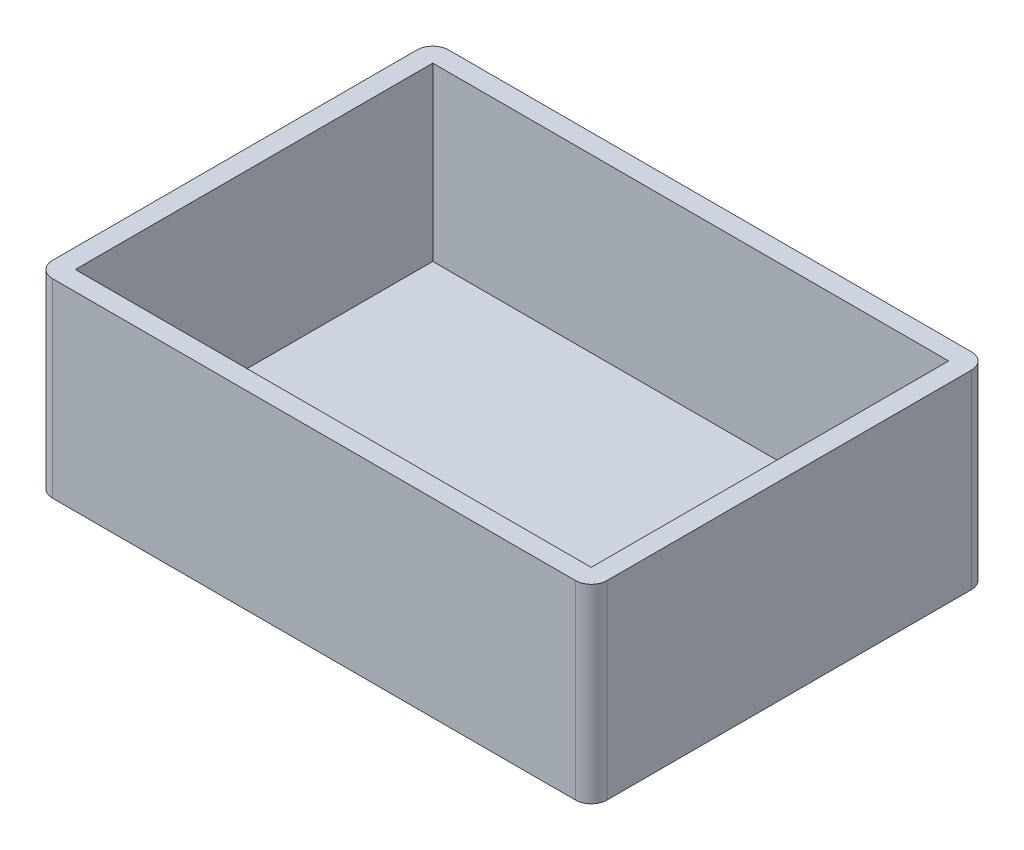
ISO-10303-21;
HEADER;
FILE_DESCRIPTION(('STEP AP214'),'2;1');
FILE_NAME('part.step','',(''),(''),'','','');
FILE_SCHEMA(('AUTOMOTIVE_DESIGN { 1 0 10303 214 1 1 1 1 }'));
ENDSEC;
DATA;
#1=APPLICATION_CONTEXT('core data for automotive mechanical design processes');
#2=APPLICATION_PROTOCOL_DEFINITION('international standard','automotive_design',2000,#1);
#3=PRODUCT_CONTEXT('',#1,'mechanical');
#4=PRODUCT('Part','Part','',(#3));
#5=PRODUCT_RELATED_PRODUCT_CATEGORY('part','',(#4));
#6=PRODUCT_DEFINITION_FORMATION('','',#4);
#7=PRODUCT_DEFINITION_CONTEXT('part definition',#1,'design');
#8=PRODUCT_DEFINITION('design','',#6,#7);
#9=PRODUCT_DEFINITION_SHAPE('','',#8);
#10=(LENGTH_UNIT() NAMED_UNIT(*) SI_UNIT(.MILLI.,.METRE.));
#11=(NAMED_UNIT(*) PLANE_ANGLE_UNIT() SI_UNIT($,.RADIAN.));
#12=(NAMED_UNIT(*) SI_UNIT($,.STERADIAN.) SOLID_ANGLE_UNIT());
#13=UNCERTAINTY_MEASURE_WITH_UNIT(LENGTH_MEASURE(1.E-05),#10,'distance_accuracy_value','');
#14=(GEOMETRIC_REPRESENTATION_CONTEXT(3) GLOBAL_UNCERTAINTY_ASSIGNED_CONTEXT((#13)) GLOBAL_UNIT_ASSIGNED_CONTEXT((#10,
#11,#12)) REPRESENTATION_CONTEXT('',''));
#15=CARTESIAN_POINT('',(0.,0.,0.));
#16=DIRECTION('',(0.,0.,1.));
#17=DIRECTION('',(1.,0.,0.));
#18=AXIS2_PLACEMENT_3D('',#15,#16,#17);
#19=CARTESIAN_POINT('',(0.,120.,0.));
#20=DIRECTION('',(0.,1.,0.));
#21=DIRECTION('',(0.,0.,1.));
#22=AXIS2_PLACEMENT_3D('',#19,#20,#21);
#23=PLANE('',#22);
#24=DIRECTION('',(1.,0.,0.));
#25=VECTOR('',#24,1.);
#26=CARTESIAN_POINT('',(175.,120.,125.));
#27=LINE('',#26,#25);
#28=CARTESIAN_POINT('',(-165.,120.,125.));
#29=VERTEX_POINT('',#28);
#30=CARTESIAN_POINT('',(165.,120.,125.));
#31=VERTEX_POINT('',#30);
#32=EDGE_CURVE('E216',#29,#31,#27,.T.);
#33=ORIENTED_EDGE('',*,*,#32,.T.);
#34=CARTESIAN_POINT('',(165.,120.,115.));
#35=DIRECTION('',(0.,1.,0.));
#36=DIRECTION('',(0.,0.,1.));
#37=AXIS2_PLACEMENT_3D('',#34,#35,#36);
#38=CIRCLE('',#37,10.);
#39=CARTESIAN_POINT('',(175.,120.,115.));
#40=VERTEX_POINT('',#39);
#41=EDGE_CURVE('E256',#31,#40,#38,.T.);
#42=ORIENTED_EDGE('',*,*,#41,.T.);
#43=DIRECTION('',(0.,0.,-1.));
#44=VECTOR('',#43,1.);
#45=CARTESIAN_POINT('',(175.,120.,125.));
#46=LINE('',#45,#44);
#47=CARTESIAN_POINT('',(175.,120.,-115.));
#48=VERTEX_POINT('',#47);
#49=EDGE_CURVE('E220',#40,#48,#46,.T.);
#50=ORIENTED_EDGE('',*,*,#49,.T.);
#51=CARTESIAN_POINT('',(165.,120.,-115.));
#52=DIRECTION('',(0.,1.,0.));
#53=DIRECTION('',(0.,0.,1.));
#54=AXIS2_PLACEMENT_3D('',#51,#52,#53);
#55=CIRCLE('',#54,10.);
#56=CARTESIAN_POINT('',(165.,120.,-125.));
#57=VERTEX_POINT('',#56);
#58=EDGE_CURVE('E69',#48,#57,#55,.T.);
#59=ORIENTED_EDGE('',*,*,#58,.T.);
#60=DIRECTION('',(-1.,0.,0.));
#61=VECTOR('',#60,1.);
#62=CARTESIAN_POINT('',(175.,120.,-125.));
#63=LINE('',#62,#61);
#64=CARTESIAN_POINT('',(-165.,120.,-125.));
#65=VERTEX_POINT('',#64);
#66=EDGE_CURVE('E222',#57,#65,#63,.T.);
#67=ORIENTED_EDGE('',*,*,#66,.T.);
#68=CARTESIAN_POINT('',(-165.,120.,-115.));
#69=DIRECTION('',(0.,1.,0.));
#70=DIRECTION('',(0.,0.,1.));
#71=AXIS2_PLACEMENT_3D('',#68,#69,#70);
#72=CIRCLE('',#71,10.);
#73=CARTESIAN_POINT('',(-175.,120.,-115.));
#74=VERTEX_POINT('',#73);
#75=EDGE_CURVE('E252',#65,#74,#72,.T.);
#76=ORIENTED_EDGE('',*,*,#75,.T.);
#77=DIRECTION('',(0.,0.,1.));
#78=VECTOR('',#77,1.);
#79=CARTESIAN_POINT('',(-175.,120.,125.));
#80=LINE('',#79,#78);
#81=CARTESIAN_POINT('',(-175.,120.,115.));
#82=VERTEX_POINT('',#81);
#83=EDGE_CURVE('E213',#74,#82,#80,.T.);
#84=ORIENTED_EDGE('',*,*,#83,.T.);
#85=CARTESIAN_POINT('',(-165.,120.,115.));
#86=DIRECTION('',(0.,1.,0.));
#87=DIRECTION('',(0.,0.,1.));
#88=AXIS2_PLACEMENT_3D('',#85,#86,#87);
#89=CIRCLE('',#88,10.);
#90=EDGE_CURVE('E254',#82,#29,#89,.T.);
#91=ORIENTED_EDGE('',*,*,#90,.T.);
#92=EDGE_LOOP('',(#33,#42,#50,#59,#67,#76,#84,#91));
#93=FACE_BOUND('',#92,.T.);
#94=DIRECTION('',(1.,0.,0.));
#95=VECTOR('',#94,1.);
#96=CARTESIAN_POINT('',(162.8,120.,112.805));
#97=LINE('',#96,#95);
#98=CARTESIAN_POINT('',(-162.8,120.,112.805));
#99=VERTEX_POINT('',#98);
#100=CARTESIAN_POINT('',(162.8,120.,112.805));
#101=VERTEX_POINT('',#100);
#102=EDGE_CURVE('E194',#99,#101,#97,.T.);
#103=ORIENTED_EDGE('',*,*,#102,.F.);
#104=DIRECTION('',(0.,0.,1.));
#105=VECTOR('',#104,1.);
#106=CARTESIAN_POINT('',(-162.8,120.,112.805));
#107=LINE('',#106,#105);
#108=CARTESIAN_POINT('',(-162.8,120.,-112.805));
#109=VERTEX_POINT('',#108);
#110=EDGE_CURVE('E192',#109,#99,#107,.T.);
#111=ORIENTED_EDGE('',*,*,#110,.F.);
#112=DIRECTION('',(-1.,0.,0.));
#113=VECTOR('',#112,1.);
#114=CARTESIAN_POINT('',(162.8,120.,-112.805));
#115=LINE('',#114,#113);
#116=CARTESIAN_POINT('',(162.8,120.,-112.805));
#117=VERTEX_POINT('',#116);
#118=EDGE_CURVE('E199',#117,#109,#115,.T.);
#119=ORIENTED_EDGE('',*,*,#118,.F.);
#120=DIRECTION('',(0.,0.,-1.));
#121=VECTOR('',#120,1.);
#122=CARTESIAN_POINT('',(162.8,120.,112.805));
#123=LINE('',#122,#121);
#124=EDGE_CURVE('E196',#101,#117,#123,.T.);
#125=ORIENTED_EDGE('',*,*,#124,.F.);
#126=EDGE_LOOP('',(#103,#111,#119,#125));
#127=FACE_BOUND('',#126,.T.);
#128=ADVANCED_FACE('F49',(#93,#127),#23,.T.);
#129=CARTESIAN_POINT('',(0.,0.,0.));
#130=DIRECTION('',(0.,1.,0.));
#131=DIRECTION('',(0.,0.,1.));
#132=AXIS2_PLACEMENT_3D('',#129,#130,#131);
#133=PLANE('',#132);
#134=CARTESIAN_POINT('',(-155.,0.,105.));
#135=DIRECTION('',(0.,-1.,0.));
#136=DIRECTION('',(0.,0.,-1.));
#137=AXIS2_PLACEMENT_3D('',#134,#135,#136);
#138=CIRCLE('',#137,4.20000000000001);
#139=CARTESIAN_POINT('',(-155.,0.,100.8));
#140=VERTEX_POINT('',#139);
#141=EDGE_CURVE('E159',#140,#140,#138,.T.);
#142=ORIENTED_EDGE('',*,*,#141,.F.);
#143=EDGE_LOOP('',(#142));
#144=FACE_BOUND('',#143,.T.);
#145=CARTESIAN_POINT('',(155.,0.,105.));
#146=DIRECTION('',(0.,-1.,0.));
#147=DIRECTION('',(0.,0.,-1.));
#148=AXIS2_PLACEMENT_3D('',#145,#146,#147);
#149=CIRCLE('',#148,4.20000000000001);
#150=CARTESIAN_POINT('',(155.,0.,100.8));
#151=VERTEX_POINT('',#150);
#152=EDGE_CURVE('E158',#151,#151,#149,.T.);
#153=ORIENTED_EDGE('',*,*,#152,.F.);
#154=EDGE_LOOP('',(#153));
#155=FACE_BOUND('',#154,.T.);
#156=CARTESIAN_POINT('',(155.,0.,-105.));
#157=DIRECTION('',(0.,-1.,0.));
#158=DIRECTION('',(0.,0.,-1.));
#159=AXIS2_PLACEMENT_3D('',#156,#157,#158);
#160=CIRCLE('',#159,4.20000000000001);
#161=CARTESIAN_POINT('',(155.,0.,-109.2));
#162=VERTEX_POINT('',#161);
#163=EDGE_CURVE('E169',#162,#162,#160,.T.);
#164=ORIENTED_EDGE('',*,*,#163,.F.);
#165=EDGE_LOOP('',(#164));
#166=FACE_BOUND('',#165,.T.);
#167=CARTESIAN_POINT('',(-155.,0.,-105.));
#168=DIRECTION('',(0.,-1.,0.));
#169=DIRECTION('',(0.,0.,-1.));
#170=AXIS2_PLACEMENT_3D('',#167,#168,#169);
#171=CIRCLE('',#170,4.20000000000001);
#172=CARTESIAN_POINT('',(-155.,0.,-109.2));
#173=VERTEX_POINT('',#172);
#174=EDGE_CURVE('E175',#173,#173,#171,.T.);
#175=ORIENTED_EDGE('',*,*,#174,.F.);
#176=EDGE_LOOP('',(#175));
#177=FACE_BOUND('',#176,.T.);
#178=DIRECTION('',(0.,0.,-1.));
#179=VECTOR('',#178,1.);
#180=CARTESIAN_POINT('',(175.,0.,125.));
#181=LINE('',#180,#179);
#182=CARTESIAN_POINT('',(175.,0.,115.));
#183=VERTEX_POINT('',#182);
#184=CARTESIAN_POINT('',(175.,0.,-115.));
#185=VERTEX_POINT('',#184);
#186=EDGE_CURVE('E230',#183,#185,#181,.T.);
#187=ORIENTED_EDGE('',*,*,#186,.F.);
#188=CARTESIAN_POINT('',(165.,0.,115.));
#189=DIRECTION('',(0.,1.,0.));
#190=DIRECTION('',(0.,0.,1.));
#191=AXIS2_PLACEMENT_3D('',#188,#189,#190);
#192=CIRCLE('',#191,10.);
#193=CARTESIAN_POINT('',(165.,0.,125.));
#194=VERTEX_POINT('',#193);
#195=EDGE_CURVE('E244',#183,#194,#192,.F.);
#196=ORIENTED_EDGE('',*,*,#195,.T.);
#197=DIRECTION('',(1.,0.,0.));
#198=VECTOR('',#197,1.);
#199=CARTESIAN_POINT('',(175.,0.,125.));
#200=LINE('',#199,#198);
#201=CARTESIAN_POINT('',(-165.,0.,125.));
#202=VERTEX_POINT('',#201);
#203=EDGE_CURVE('E227',#202,#194,#200,.T.);
#204=ORIENTED_EDGE('',*,*,#203,.F.);
#205=CARTESIAN_POINT('',(-165.,0.,115.));
#206=DIRECTION('',(0.,1.,0.));
#207=DIRECTION('',(0.,0.,1.));
#208=AXIS2_PLACEMENT_3D('',#205,#206,#207);
#209=CIRCLE('',#208,10.);
#210=CARTESIAN_POINT('',(-175.,0.,115.));
#211=VERTEX_POINT('',#210);
#212=EDGE_CURVE('E242',#202,#211,#209,.F.);
#213=ORIENTED_EDGE('',*,*,#212,.T.);
#214=DIRECTION('',(0.,0.,1.));
#215=VECTOR('',#214,1.);
#216=CARTESIAN_POINT('',(-175.,0.,125.));
#217=LINE('',#216,#215);
#218=CARTESIAN_POINT('',(-175.,0.,-115.));
#219=VERTEX_POINT('',#218);
#220=EDGE_CURVE('E212',#219,#211,#217,.T.);
#221=ORIENTED_EDGE('',*,*,#220,.F.);
#222=CARTESIAN_POINT('',(-165.,0.,-115.));
#223=DIRECTION('',(0.,1.,0.));
#224=DIRECTION('',(0.,0.,1.));
#225=AXIS2_PLACEMENT_3D('',#222,#223,#224);
#226=CIRCLE('',#225,10.);
#227=CARTESIAN_POINT('',(-165.,0.,-125.));
#228=VERTEX_POINT('',#227);
#229=EDGE_CURVE('E240',#219,#228,#226,.F.);
#230=ORIENTED_EDGE('',*,*,#229,.T.);
#231=DIRECTION('',(-1.,0.,0.));
#232=VECTOR('',#231,1.);
#233=CARTESIAN_POINT('',(175.,0.,-125.));
#234=LINE('',#233,#232);
#235=CARTESIAN_POINT('',(165.,0.,-125.));
#236=VERTEX_POINT('',#235);
#237=EDGE_CURVE('E217',#236,#228,#234,.T.);
#238=ORIENTED_EDGE('',*,*,#237,.F.);
#239=CARTESIAN_POINT('',(165.,0.,-115.));
#240=DIRECTION('',(0.,1.,0.));
#241=DIRECTION('',(0.,0.,1.));
#242=AXIS2_PLACEMENT_3D('',#239,#240,#241);
#243=CIRCLE('',#242,10.);
#244=EDGE_CURVE('E238',#236,#185,#243,.F.);
#245=ORIENTED_EDGE('',*,*,#244,.T.);
#246=EDGE_LOOP('',(#187,#196,#204,#213,#221,#230,#238,#245));
#247=FACE_BOUND('',#246,.T.);
#248=ADVANCED_FACE('F269',(#144,#155,#166,#177,#247),#133,.F.);
#249=CARTESIAN_POINT('',(-175.,120.,125.));
#250=DIRECTION('',(1.,0.,0.));
#251=DIRECTION('',(0.,0.,-1.));
#252=AXIS2_PLACEMENT_3D('',#249,#250,#251);
#253=PLANE('',#252);
#254=ORIENTED_EDGE('',*,*,#220,.T.);
#255=DIRECTION('',(0.,-1.,0.));
#256=VECTOR('',#255,1.);
#257=CARTESIAN_POINT('',(-175.,120.,115.));
#258=LINE('',#257,#256);
#259=EDGE_CURVE('E261',#211,#82,#258,.F.);
#260=ORIENTED_EDGE('',*,*,#259,.T.);
#261=ORIENTED_EDGE('',*,*,#83,.F.);
#262=DIRECTION('',(0.,-1.,0.));
#263=VECTOR('',#262,1.);
#264=CARTESIAN_POINT('',(-175.,120.,-115.));
#265=LINE('',#264,#263);
#266=EDGE_CURVE('E258',#74,#219,#265,.T.);
#267=ORIENTED_EDGE('',*,*,#266,.T.);
#268=EDGE_LOOP('',(#254,#260,#261,#267));
#269=FACE_BOUND('',#268,.T.);
#270=ADVANCED_FACE('F277',(#269),#253,.F.);
#271=CARTESIAN_POINT('',(175.,120.,125.));
#272=DIRECTION('',(0.,0.,-1.));
#273=DIRECTION('',(-1.,0.,0.));
#274=AXIS2_PLACEMENT_3D('',#271,#272,#273);
#275=PLANE('',#274);
#276=ORIENTED_EDGE('',*,*,#203,.T.);
#277=DIRECTION('',(0.,-1.,0.));
#278=VECTOR('',#277,1.);
#279=CARTESIAN_POINT('',(165.,120.,125.));
#280=LINE('',#279,#278);
#281=EDGE_CURVE('E249',#194,#31,#280,.F.);
#282=ORIENTED_EDGE('',*,*,#281,.T.);
#283=ORIENTED_EDGE('',*,*,#32,.F.);
#284=DIRECTION('',(0.,-1.,0.));
#285=VECTOR('',#284,1.);
#286=CARTESIAN_POINT('',(-165.,120.,125.));
#287=LINE('',#286,#285);
#288=EDGE_CURVE('E246',#29,#202,#287,.T.);
#289=ORIENTED_EDGE('',*,*,#288,.T.);
#290=EDGE_LOOP('',(#276,#282,#283,#289));
#291=FACE_BOUND('',#290,.T.);
#292=ADVANCED_FACE('F287',(#291),#275,.F.);
#293=CARTESIAN_POINT('',(175.,120.,125.));
#294=DIRECTION('',(-1.,0.,0.));
#295=DIRECTION('',(0.,0.,1.));
#296=AXIS2_PLACEMENT_3D('',#293,#294,#295);
#297=PLANE('',#296);
#298=ORIENTED_EDGE('',*,*,#49,.F.);
#299=DIRECTION('',(0.,-1.,0.));
#300=VECTOR('',#299,1.);
#301=CARTESIAN_POINT('',(175.,120.,115.));
#302=LINE('',#301,#300);
#303=EDGE_CURVE('E235',#40,#183,#302,.T.);
#304=ORIENTED_EDGE('',*,*,#303,.T.);
#305=ORIENTED_EDGE('',*,*,#186,.T.);
#306=DIRECTION('',(0.,-1.,0.));
#307=VECTOR('',#306,1.);
#308=CARTESIAN_POINT('',(175.,120.,-115.));
#309=LINE('',#308,#307);
#310=EDGE_CURVE('E224',#185,#48,#309,.F.);
#311=ORIENTED_EDGE('',*,*,#310,.T.);
#312=EDGE_LOOP('',(#298,#304,#305,#311));
#313=FACE_BOUND('',#312,.T.);
#314=ADVANCED_FACE('F295',(#313),#297,.F.);
#315=CARTESIAN_POINT('',(175.,120.,-125.));
#316=DIRECTION('',(0.,0.,1.));
#317=DIRECTION('',(1.,0.,0.));
#318=AXIS2_PLACEMENT_3D('',#315,#316,#317);
#319=PLANE('',#318);
#320=ORIENTED_EDGE('',*,*,#237,.T.);
#321=DIRECTION('',(0.,-1.,0.));
#322=VECTOR('',#321,1.);
#323=CARTESIAN_POINT('',(-165.,120.,-125.));
#324=LINE('',#323,#322);
#325=EDGE_CURVE('E13',#228,#65,#324,.F.);
#326=ORIENTED_EDGE('',*,*,#325,.T.);
#327=ORIENTED_EDGE('',*,*,#66,.F.);
#328=DIRECTION('',(0.,-1.,0.));
#329=VECTOR('',#328,1.);
#330=CARTESIAN_POINT('',(165.,120.,-125.));
#331=LINE('',#330,#329);
#332=EDGE_CURVE('E57',#57,#236,#331,.T.);
#333=ORIENTED_EDGE('',*,*,#332,.T.);
#334=EDGE_LOOP('',(#320,#326,#327,#333));
#335=FACE_BOUND('',#334,.T.);
#336=ADVANCED_FACE('F265',(#335),#319,.F.);
#337=CARTESIAN_POINT('',(-162.8,120.,112.805));
#338=DIRECTION('',(1.,0.,0.));
#339=DIRECTION('',(0.,0.,-1.));
#340=AXIS2_PLACEMENT_3D('',#337,#338,#339);
#341=PLANE('',#340);
#342=DIRECTION('',(0.,0.,-1.));
#343=VECTOR('',#342,1.);
#344=CARTESIAN_POINT('',(-162.8,11.6,0.));
#345=LINE('',#344,#343);
#346=CARTESIAN_POINT('',(-162.8,11.6,112.805));
#347=VERTEX_POINT('',#346);
#348=CARTESIAN_POINT('',(-162.8,11.6,-112.805));
#349=VERTEX_POINT('',#348);
#350=EDGE_CURVE('E181',#347,#349,#345,.T.);
#351=ORIENTED_EDGE('',*,*,#350,.T.);
#352=DIRECTION('',(0.,-1.,0.));
#353=VECTOR('',#352,1.);
#354=CARTESIAN_POINT('',(-162.8,120.,-112.805));
#355=LINE('',#354,#353);
#356=EDGE_CURVE('E201',#109,#349,#355,.T.);
#357=ORIENTED_EDGE('',*,*,#356,.F.);
#358=ORIENTED_EDGE('',*,*,#110,.T.);
#359=DIRECTION('',(0.,-1.,0.));
#360=VECTOR('',#359,1.);
#361=CARTESIAN_POINT('',(-162.8,120.,112.805));
#362=LINE('',#361,#360);
#363=EDGE_CURVE('E209',#99,#347,#362,.T.);
#364=ORIENTED_EDGE('',*,*,#363,.T.);
#365=EDGE_LOOP('',(#351,#357,#358,#364));
#366=FACE_BOUND('',#365,.T.);
#367=ADVANCED_FACE('F314',(#366),#341,.T.);
#368=CARTESIAN_POINT('',(162.8,120.,112.805));
#369=DIRECTION('',(0.,0.,-1.));
#370=DIRECTION('',(-1.,0.,0.));
#371=AXIS2_PLACEMENT_3D('',#368,#369,#370);
#372=PLANE('',#371);
#373=DIRECTION('',(-1.,0.,0.));
#374=VECTOR('',#373,1.);
#375=CARTESIAN_POINT('',(0.,11.6,112.805));
#376=LINE('',#375,#374);
#377=CARTESIAN_POINT('',(162.8,11.6,112.805));
#378=VERTEX_POINT('',#377);
#379=EDGE_CURVE('E184',#378,#347,#376,.T.);
#380=ORIENTED_EDGE('',*,*,#379,.T.);
#381=ORIENTED_EDGE('',*,*,#363,.F.);
#382=ORIENTED_EDGE('',*,*,#102,.T.);
#383=DIRECTION('',(0.,-1.,0.));
#384=VECTOR('',#383,1.);
#385=CARTESIAN_POINT('',(162.8,120.,112.805));
#386=LINE('',#385,#384);
#387=EDGE_CURVE('E206',#101,#378,#386,.T.);
#388=ORIENTED_EDGE('',*,*,#387,.T.);
#389=EDGE_LOOP('',(#380,#381,#382,#388));
#390=FACE_BOUND('',#389,.T.);
#391=ADVANCED_FACE('F433',(#390),#372,.T.);
#392=CARTESIAN_POINT('',(162.8,120.,112.805));
#393=DIRECTION('',(-1.,0.,0.));
#394=DIRECTION('',(0.,0.,1.));
#395=AXIS2_PLACEMENT_3D('',#392,#393,#394);
#396=PLANE('',#395);
#397=DIRECTION('',(0.,0.,-1.));
#398=VECTOR('',#397,1.);
#399=CARTESIAN_POINT('',(162.8,11.6,0.));
#400=LINE('',#399,#398);
#401=CARTESIAN_POINT('',(162.8,11.6,-112.805));
#402=VERTEX_POINT('',#401);
#403=EDGE_CURVE('E186',#378,#402,#400,.T.);
#404=ORIENTED_EDGE('',*,*,#403,.F.);
#405=ORIENTED_EDGE('',*,*,#387,.F.);
#406=ORIENTED_EDGE('',*,*,#124,.T.);
#407=DIRECTION('',(0.,-1.,0.));
#408=VECTOR('',#407,1.);
#409=CARTESIAN_POINT('',(162.8,120.,-112.805));
#410=LINE('',#409,#408);
#411=EDGE_CURVE('E203',#117,#402,#410,.T.);
#412=ORIENTED_EDGE('',*,*,#411,.T.);
#413=EDGE_LOOP('',(#404,#405,#406,#412));
#414=FACE_BOUND('',#413,.T.);
#415=ADVANCED_FACE('F430',(#414),#396,.T.);
#416=CARTESIAN_POINT('',(162.8,120.,-112.805));
#417=DIRECTION('',(0.,0.,1.));
#418=DIRECTION('',(1.,0.,0.));
#419=AXIS2_PLACEMENT_3D('',#416,#417,#418);
#420=PLANE('',#419);
#421=DIRECTION('',(-1.,0.,0.));
#422=VECTOR('',#421,1.);
#423=CARTESIAN_POINT('',(0.,11.6,-112.805));
#424=LINE('',#423,#422);
#425=EDGE_CURVE('E189',#402,#349,#424,.T.);
#426=ORIENTED_EDGE('',*,*,#425,.F.);
#427=ORIENTED_EDGE('',*,*,#411,.F.);
#428=ORIENTED_EDGE('',*,*,#118,.T.);
#429=ORIENTED_EDGE('',*,*,#356,.T.);
#430=EDGE_LOOP('',(#426,#427,#428,#429));
#431=FACE_BOUND('',#430,.T.);
#432=ADVANCED_FACE('F426',(#431),#420,.T.);
#433=CARTESIAN_POINT('',(0.,11.6,0.));
#434=DIRECTION('',(0.,1.,0.));
#435=DIRECTION('',(0.,0.,1.));
#436=AXIS2_PLACEMENT_3D('',#433,#434,#435);
#437=PLANE('',#436);
#438=ORIENTED_EDGE('',*,*,#350,.F.);
#439=ORIENTED_EDGE('',*,*,#379,.F.);
#440=ORIENTED_EDGE('',*,*,#403,.T.);
#441=ORIENTED_EDGE('',*,*,#425,.T.);
#442=EDGE_LOOP('',(#438,#439,#440,#441));
#443=FACE_BOUND('',#442,.T.);
#444=ADVANCED_FACE('F327',(#443),#437,.T.);
#445=CARTESIAN_POINT('',(165.,120.,115.));
#446=DIRECTION('',(0.,-1.,0.));
#447=DIRECTION('',(0.,0.,-1.));
#448=AXIS2_PLACEMENT_3D('',#445,#446,#447);
#449=CYLINDRICAL_SURFACE('',#448,10.);
#450=ORIENTED_EDGE('',*,*,#41,.F.);
#451=ORIENTED_EDGE('',*,*,#281,.F.);
#452=ORIENTED_EDGE('',*,*,#195,.F.);
#453=ORIENTED_EDGE('',*,*,#303,.F.);
#454=EDGE_LOOP('',(#450,#451,#452,#453));
#455=FACE_BOUND('',#454,.T.);
#456=ADVANCED_FACE('F292',(#455),#449,.T.);
#457=CARTESIAN_POINT('',(-165.,120.,115.));
#458=DIRECTION('',(0.,-1.,0.));
#459=DIRECTION('',(0.,0.,-1.));
#460=AXIS2_PLACEMENT_3D('',#457,#458,#459);
#461=CYLINDRICAL_SURFACE('',#460,10.);
#462=ORIENTED_EDGE('',*,*,#90,.F.);
#463=ORIENTED_EDGE('',*,*,#259,.F.);
#464=ORIENTED_EDGE('',*,*,#212,.F.);
#465=ORIENTED_EDGE('',*,*,#288,.F.);
#466=EDGE_LOOP('',(#462,#463,#464,#465));
#467=FACE_BOUND('',#466,.T.);
#468=ADVANCED_FACE('F284',(#467),#461,.T.);
#469=CARTESIAN_POINT('',(-165.,120.,-115.));
#470=DIRECTION('',(0.,-1.,0.));
#471=DIRECTION('',(0.,0.,-1.));
#472=AXIS2_PLACEMENT_3D('',#469,#470,#471);
#473=CYLINDRICAL_SURFACE('',#472,10.);
#474=ORIENTED_EDGE('',*,*,#75,.F.);
#475=ORIENTED_EDGE('',*,*,#325,.F.);
#476=ORIENTED_EDGE('',*,*,#229,.F.);
#477=ORIENTED_EDGE('',*,*,#266,.F.);
#478=EDGE_LOOP('',(#474,#475,#476,#477));
#479=FACE_BOUND('',#478,.T.);
#480=ADVANCED_FACE('F274',(#479),#473,.T.);
#481=CARTESIAN_POINT('',(165.,120.,-115.));
#482=DIRECTION('',(0.,-1.,0.));
#483=DIRECTION('',(0.,0.,-1.));
#484=AXIS2_PLACEMENT_3D('',#481,#482,#483);
#485=CYLINDRICAL_SURFACE('',#484,10.);
#486=ORIENTED_EDGE('',*,*,#58,.F.);
#487=ORIENTED_EDGE('',*,*,#310,.F.);
#488=ORIENTED_EDGE('',*,*,#244,.F.);
#489=ORIENTED_EDGE('',*,*,#332,.F.);
#490=EDGE_LOOP('',(#486,#487,#488,#489));
#491=FACE_BOUND('',#490,.T.);
#492=ADVANCED_FACE('F51',(#491),#485,.T.);
#493=CARTESIAN_POINT('',(-155.,8.,-105.));
#494=DIRECTION('',(0.,-1.,0.));
#495=DIRECTION('',(0.,0.,-1.));
#496=AXIS2_PLACEMENT_3D('',#493,#494,#495);
#497=CONICAL_SURFACE('',#496,4.20000000000001,1.02974425867666);
#498=CARTESIAN_POINT('',(-155.,10.5236145999158,-105.));
#499=VERTEX_POINT('',#498);
#500=VERTEX_LOOP('',#499);
#501=FACE_BOUND('',#500,.T.);
#502=CARTESIAN_POINT('',(-155.,8.,-105.));
#503=DIRECTION('',(0.,-1.,0.));
#504=DIRECTION('',(0.,0.,-1.));
#505=AXIS2_PLACEMENT_3D('',#502,#503,#504);
#506=CIRCLE('',#505,4.20000000000001);
#507=CARTESIAN_POINT('',(-155.,8.,-109.2));
#508=VERTEX_POINT('',#507);
#509=EDGE_CURVE('E178',#508,#508,#506,.T.);
#510=ORIENTED_EDGE('',*,*,#509,.T.);
#511=EDGE_LOOP('',(#510));
#512=FACE_BOUND('',#511,.T.);
#513=ADVANCED_FACE('F298',(#501,#512),#497,.F.);
#514=CARTESIAN_POINT('',(-155.,0.,-105.));
#515=DIRECTION('',(0.,-1.,0.));
#516=DIRECTION('',(0.,0.,-1.));
#517=AXIS2_PLACEMENT_3D('',#514,#515,#516);
#518=CYLINDRICAL_SURFACE('',#517,4.20000000000001);
#519=ORIENTED_EDGE('',*,*,#509,.F.);
#520=EDGE_LOOP('',(#519));
#521=FACE_BOUND('',#520,.T.);
#522=ORIENTED_EDGE('',*,*,#174,.T.);
#523=EDGE_LOOP('',(#522));
#524=FACE_BOUND('',#523,.T.);
#525=ADVANCED_FACE('F303',(#521,#524),#518,.F.);
#526=CARTESIAN_POINT('',(155.,8.,-105.));
#527=DIRECTION('',(0.,-1.,0.));
#528=DIRECTION('',(0.,0.,-1.));
#529=AXIS2_PLACEMENT_3D('',#526,#527,#528);
#530=CONICAL_SURFACE('',#529,4.20000000000001,1.02974425867666);
#531=CARTESIAN_POINT('',(155.,10.5236145999158,-105.));
#532=VERTEX_POINT('',#531);
#533=VERTEX_LOOP('',#532);
#534=FACE_BOUND('',#533,.T.);
#535=CARTESIAN_POINT('',(155.,8.,-105.));
#536=DIRECTION('',(0.,-1.,0.));
#537=DIRECTION('',(0.,0.,-1.));
#538=AXIS2_PLACEMENT_3D('',#535,#536,#537);
#539=CIRCLE('',#538,4.20000000000001);
#540=CARTESIAN_POINT('',(155.,8.,-109.2));
#541=VERTEX_POINT('',#540);
#542=EDGE_CURVE('E172',#541,#541,#539,.T.);
#543=ORIENTED_EDGE('',*,*,#542,.T.);
#544=EDGE_LOOP('',(#543));
#545=FACE_BOUND('',#544,.T.);
#546=ADVANCED_FACE('F366',(#534,#545),#530,.F.);
#547=CARTESIAN_POINT('',(155.,0.,-105.));
#548=DIRECTION('',(0.,-1.,0.));
#549=DIRECTION('',(0.,0.,-1.));
#550=AXIS2_PLACEMENT_3D('',#547,#548,#549);
#551=CYLINDRICAL_SURFACE('',#550,4.20000000000001);
#552=ORIENTED_EDGE('',*,*,#542,.F.);
#553=EDGE_LOOP('',(#552));
#554=FACE_BOUND('',#553,.T.);
#555=ORIENTED_EDGE('',*,*,#163,.T.);
#556=EDGE_LOOP('',(#555));
#557=FACE_BOUND('',#556,.T.);
#558=ADVANCED_FACE('F376',(#554,#557),#551,.F.);
#559=CARTESIAN_POINT('',(155.,8.,105.));
#560=DIRECTION('',(0.,-1.,0.));
#561=DIRECTION('',(0.,0.,-1.));
#562=AXIS2_PLACEMENT_3D('',#559,#560,#561);
#563=CONICAL_SURFACE('',#562,4.20000000000001,1.02974425867666);
#564=CARTESIAN_POINT('',(155.,10.5236145999158,105.));
#565=VERTEX_POINT('',#564);
#566=VERTEX_LOOP('',#565);
#567=FACE_BOUND('',#566,.T.);
#568=CARTESIAN_POINT('',(155.,8.,105.));
#569=DIRECTION('',(0.,-1.,0.));
#570=DIRECTION('',(0.,0.,-1.));
#571=AXIS2_PLACEMENT_3D('',#568,#569,#570);
#572=CIRCLE('',#571,4.20000000000001);
#573=CARTESIAN_POINT('',(155.,8.,100.8));
#574=VERTEX_POINT('',#573);
#575=EDGE_CURVE('E162',#574,#574,#572,.T.);
#576=ORIENTED_EDGE('',*,*,#575,.T.);
#577=EDGE_LOOP('',(#576));
#578=FACE_BOUND('',#577,.T.);
#579=ADVANCED_FACE('F386',(#567,#578),#563,.F.);
#580=CARTESIAN_POINT('',(155.,0.,105.));
#581=DIRECTION('',(0.,-1.,0.));
#582=DIRECTION('',(0.,0.,-1.));
#583=AXIS2_PLACEMENT_3D('',#580,#581,#582);
#584=CYLINDRICAL_SURFACE('',#583,4.20000000000001);
#585=ORIENTED_EDGE('',*,*,#575,.F.);
#586=EDGE_LOOP('',(#585));
#587=FACE_BOUND('',#586,.T.);
#588=ORIENTED_EDGE('',*,*,#152,.T.);
#589=EDGE_LOOP('',(#588));
#590=FACE_BOUND('',#589,.T.);
#591=ADVANCED_FACE('F152',(#587,#590),#584,.F.);
#592=CARTESIAN_POINT('',(-155.,8.,105.));
#593=DIRECTION('',(0.,-1.,0.));
#594=DIRECTION('',(0.,0.,-1.));
#595=AXIS2_PLACEMENT_3D('',#592,#593,#594);
#596=CONICAL_SURFACE('',#595,4.20000000000001,1.02974425867666);
#597=CARTESIAN_POINT('',(-155.,10.5236145999158,105.));
#598=VERTEX_POINT('',#597);
#599=VERTEX_LOOP('',#598);
#600=FACE_BOUND('',#599,.T.);
#601=CARTESIAN_POINT('',(-155.,8.,105.));
#602=DIRECTION('',(0.,-1.,0.));
#603=DIRECTION('',(0.,0.,-1.));
#604=AXIS2_PLACEMENT_3D('',#601,#602,#603);
#605=CIRCLE('',#604,4.20000000000001);
#606=CARTESIAN_POINT('',(-155.,8.,100.8));
#607=VERTEX_POINT('',#606);
#608=EDGE_CURVE('E156',#607,#607,#605,.T.);
#609=ORIENTED_EDGE('',*,*,#608,.T.);
#610=EDGE_LOOP('',(#609));
#611=FACE_BOUND('',#610,.T.);
#612=ADVANCED_FACE('F148',(#600,#611),#596,.F.);
#613=CARTESIAN_POINT('',(-155.,0.,105.));
#614=DIRECTION('',(0.,-1.,0.));
#615=DIRECTION('',(0.,0.,-1.));
#616=AXIS2_PLACEMENT_3D('',#613,#614,#615);
#617=CYLINDRICAL_SURFACE('',#616,4.20000000000001);
#618=ORIENTED_EDGE('',*,*,#608,.F.);
#619=EDGE_LOOP('',(#618));
#620=FACE_BOUND('',#619,.T.);
#621=ORIENTED_EDGE('',*,*,#141,.T.);
#622=EDGE_LOOP('',(#621));
#623=FACE_BOUND('',#622,.T.);
#624=ADVANCED_FACE('F151',(#620,#623),#617,.F.);
#625=CLOSED_SHELL('',(#128,#248,#270,#292,#314,#336,#367,#391,#415,#432,#444,#456,#468,#480,
#492,#513,#525,#546,#558,#579,#591,#612,#624));
#626=MANIFOLD_SOLID_BREP('B2',#625);
#627=ADVANCED_BREP_SHAPE_REPRESENTATION('',(#18,#626),#14);
#628=SHAPE_DEFINITION_REPRESENTATION(#9,#627);
ENDSEC;
END-ISO-10303-21;
